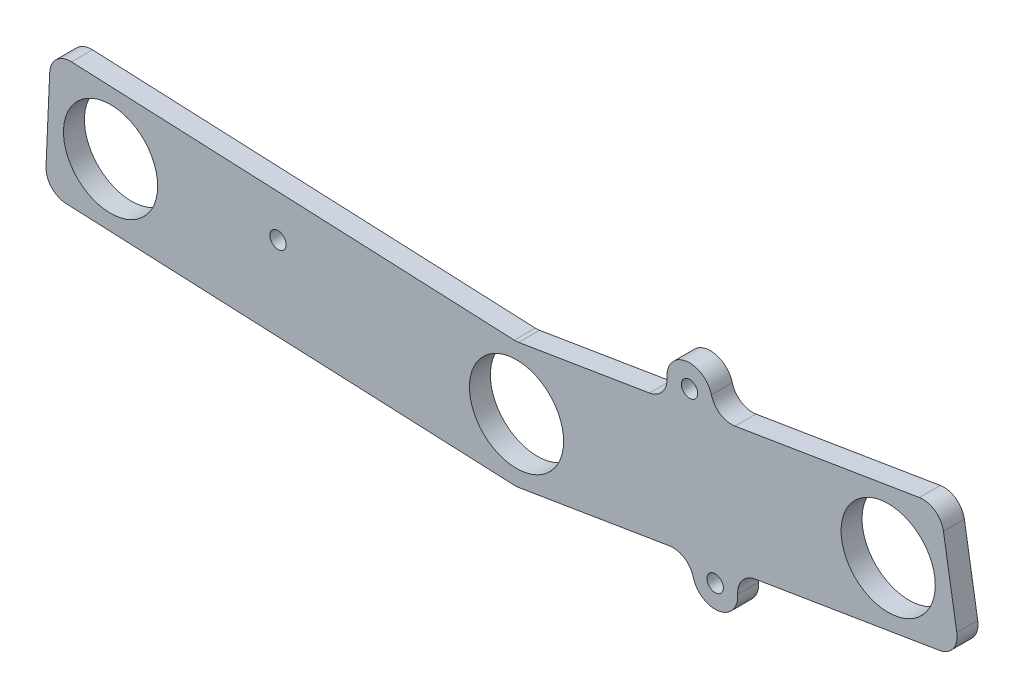
ISO-10303-21;
HEADER;
FILE_DESCRIPTION(('STEP AP214'),'2;1');
FILE_NAME('part.step','',(''),(''),'','','');
FILE_SCHEMA(('AUTOMOTIVE_DESIGN { 1 0 10303 214 1 1 1 1 }'));
ENDSEC;
DATA;
#1=APPLICATION_CONTEXT('core data for automotive mechanical design processes');
#2=APPLICATION_PROTOCOL_DEFINITION('international standard','automotive_design',2000,#1);
#3=PRODUCT_CONTEXT('',#1,'mechanical');
#4=PRODUCT('Part','Part','',(#3));
#5=PRODUCT_RELATED_PRODUCT_CATEGORY('part','',(#4));
#6=PRODUCT_DEFINITION_FORMATION('','',#4);
#7=PRODUCT_DEFINITION_CONTEXT('part definition',#1,'design');
#8=PRODUCT_DEFINITION('design','',#6,#7);
#9=PRODUCT_DEFINITION_SHAPE('','',#8);
#10=(LENGTH_UNIT() NAMED_UNIT(*) SI_UNIT(.MILLI.,.METRE.));
#11=(NAMED_UNIT(*) PLANE_ANGLE_UNIT() SI_UNIT($,.RADIAN.));
#12=(NAMED_UNIT(*) SI_UNIT($,.STERADIAN.) SOLID_ANGLE_UNIT());
#13=UNCERTAINTY_MEASURE_WITH_UNIT(LENGTH_MEASURE(1.E-05),#10,'distance_accuracy_value','');
#14=(GEOMETRIC_REPRESENTATION_CONTEXT(3) GLOBAL_UNCERTAINTY_ASSIGNED_CONTEXT((#13)) GLOBAL_UNIT_ASSIGNED_CONTEXT((#10,
#11,#12)) REPRESENTATION_CONTEXT('',''));
#15=CARTESIAN_POINT('',(0.,0.,0.));
#16=DIRECTION('',(0.,0.,1.));
#17=DIRECTION('',(1.,0.,0.));
#18=AXIS2_PLACEMENT_3D('',#15,#16,#17);
#19=CARTESIAN_POINT('',(630.154162365502,235.035371782624,3.175));
#20=DIRECTION('',(0.,0.,-1.));
#21=DIRECTION('',(-1.,0.,0.));
#22=AXIS2_PLACEMENT_3D('',#19,#20,#21);
#23=CYLINDRICAL_SURFACE('',#22,6.858);
#24=CARTESIAN_POINT('',(630.154162365502,235.035371782624,-3.175));
#25=DIRECTION('',(0.,0.,1.));
#26=DIRECTION('',(1.,0.,0.));
#27=AXIS2_PLACEMENT_3D('',#24,#25,#26);
#28=CIRCLE('',#27,6.858);
#29=CARTESIAN_POINT('',(636.785017529653,236.785778533083,-3.175));
#30=VERTEX_POINT('',#29);
#31=CARTESIAN_POINT('',(623.31217831869,234.56695070797,-3.175));
#32=VERTEX_POINT('',#31);
#33=EDGE_CURVE('E330',#30,#32,#28,.T.);
#34=ORIENTED_EDGE('',*,*,#33,.T.);
#35=DIRECTION('',(0.,0.,-1.));
#36=VECTOR('',#35,1.);
#37=CARTESIAN_POINT('',(623.31217831869,234.56695070797,3.175));
#38=LINE('',#37,#36);
#39=CARTESIAN_POINT('',(623.31217831869,234.56695070797,3.175));
#40=VERTEX_POINT('',#39);
#41=EDGE_CURVE('E294',#32,#40,#38,.F.);
#42=ORIENTED_EDGE('',*,*,#41,.T.);
#43=CARTESIAN_POINT('',(630.154162365502,235.035371782624,3.175));
#44=DIRECTION('',(0.,0.,1.));
#45=DIRECTION('',(1.,0.,0.));
#46=AXIS2_PLACEMENT_3D('',#43,#44,#45);
#47=CIRCLE('',#46,6.858);
#48=CARTESIAN_POINT('',(636.785017529653,236.785778533083,3.175));
#49=VERTEX_POINT('',#48);
#50=EDGE_CURVE('E229',#49,#40,#47,.T.);
#51=ORIENTED_EDGE('',*,*,#50,.F.);
#52=DIRECTION('',(0.,0.,-1.));
#53=VECTOR('',#52,1.);
#54=CARTESIAN_POINT('',(636.785017529653,236.785778533083,3.175));
#55=LINE('',#54,#53);
#56=EDGE_CURVE('E291',#49,#30,#55,.T.);
#57=ORIENTED_EDGE('',*,*,#56,.T.);
#58=EDGE_LOOP('',(#34,#42,#51,#57));
#59=FACE_BOUND('',#58,.T.);
#60=ADVANCED_FACE('F39',(#59),#23,.T.);
#61=CARTESIAN_POINT('',(-20.2170299694581,122.758868903176,3.175));
#62=DIRECTION('',(0.162500000001427,-0.986708543593059,0.));
#63=DIRECTION('',(0.986708543593059,0.162500000001427,0.));
#64=AXIS2_PLACEMENT_3D('',#61,#62,#63);
#65=PLANE('',#64);
#66=DIRECTION('',(-0.986708543593059,-0.162500000001427,0.));
#67=VECTOR('',#66,1.);
#68=CARTESIAN_POINT('',(-20.2170299694581,122.758868903176,3.175));
#69=LINE('',#68,#67);
#70=CARTESIAN_POINT('',(618.008882904986,227.867628238882,3.175));
#71=VERTEX_POINT('',#70);
#72=CARTESIAN_POINT('',(578.302196822218,221.32837555844,3.175));
#73=VERTEX_POINT('',#72);
#74=EDGE_CURVE('E315',#71,#73,#69,.T.);
#75=ORIENTED_EDGE('',*,*,#74,.F.);
#76=DIRECTION('',(0.,0.,1.));
#77=VECTOR('',#76,1.);
#78=CARTESIAN_POINT('',(618.008882904985,227.867628238882,-3.175));
#79=LINE('',#78,#77);
#80=CARTESIAN_POINT('',(618.008882904986,227.867628238882,-3.175));
#81=VERTEX_POINT('',#80);
#82=EDGE_CURVE('E288',#71,#81,#79,.F.);
#83=ORIENTED_EDGE('',*,*,#82,.T.);
#84=DIRECTION('',(-0.986708543593059,-0.162500000001427,0.));
#85=VECTOR('',#84,1.);
#86=CARTESIAN_POINT('',(-20.2170299694581,122.758868903176,-3.175));
#87=LINE('',#86,#85);
#88=CARTESIAN_POINT('',(578.302196822218,221.32837555844,-3.175));
#89=VERTEX_POINT('',#88);
#90=EDGE_CURVE('E206',#81,#89,#87,.T.);
#91=ORIENTED_EDGE('',*,*,#90,.T.);
#92=DIRECTION('',(0.,0.,-1.));
#93=VECTOR('',#92,1.);
#94=CARTESIAN_POINT('',(578.302196822218,221.32837555844,3.175));
#95=LINE('',#94,#93);
#96=EDGE_CURVE('E267',#89,#73,#95,.F.);
#97=ORIENTED_EDGE('',*,*,#96,.T.);
#98=EDGE_LOOP('',(#75,#83,#91,#97));
#99=FACE_BOUND('',#98,.T.);
#100=ADVANCED_FACE('F321',(#99),#65,.F.);
#101=CARTESIAN_POINT('',(10.912675494305,246.328166760933,3.175));
#102=DIRECTION('',(-0.0442579616598525,-0.99902013634847,0.));
#103=DIRECTION('',(0.99902013634847,-0.0442579616598525,0.));
#104=AXIS2_PLACEMENT_3D('',#101,#102,#103);
#105=PLANE('',#104);
#106=DIRECTION('',(-0.99902013634847,0.0442579616598525,0.));
#107=VECTOR('',#106,1.);
#108=CARTESIAN_POINT('',(10.912675494305,246.328166760933,-3.175));
#109=LINE('',#108,#107);
#110=CARTESIAN_POINT('',(576.989283765669,221.250196944443,-3.175));
#111=VERTEX_POINT('',#110);
#112=CARTESIAN_POINT('',(442.631483002649,227.202431717814,-3.175));
#113=VERTEX_POINT('',#112);
#114=EDGE_CURVE('E334',#111,#113,#109,.T.);
#115=ORIENTED_EDGE('',*,*,#114,.T.);
#116=DIRECTION('',(0.,0.,-1.));
#117=VECTOR('',#116,1.);
#118=CARTESIAN_POINT('',(442.631483002649,227.202431717814,3.175));
#119=LINE('',#118,#117);
#120=CARTESIAN_POINT('',(442.631483002649,227.202431717814,3.175));
#121=VERTEX_POINT('',#120);
#122=EDGE_CURVE('E265',#113,#121,#119,.F.);
#123=ORIENTED_EDGE('',*,*,#122,.T.);
#124=DIRECTION('',(-0.99902013634847,0.0442579616598525,0.));
#125=VECTOR('',#124,1.);
#126=CARTESIAN_POINT('',(10.912675494305,246.328166760933,3.175));
#127=LINE('',#126,#125);
#128=CARTESIAN_POINT('',(576.989283765669,221.250196944443,3.175));
#129=VERTEX_POINT('',#128);
#130=EDGE_CURVE('E325',#129,#121,#127,.T.);
#131=ORIENTED_EDGE('',*,*,#130,.F.);
#132=DIRECTION('',(0.,0.,-1.));
#133=VECTOR('',#132,1.);
#134=CARTESIAN_POINT('',(576.989283765668,221.250196944443,-3.175));
#135=LINE('',#134,#133);
#136=EDGE_CURVE('E262',#129,#111,#135,.T.);
#137=ORIENTED_EDGE('',*,*,#136,.T.);
#138=EDGE_LOOP('',(#115,#123,#131,#137));
#139=FACE_BOUND('',#138,.T.);
#140=ADVANCED_FACE('F424',(#139),#105,.F.);
#141=CARTESIAN_POINT('',(425.375029642531,-18.8446969865789,3.175));
#142=DIRECTION('',(0.99902013634847,-0.0442579616598522,0.));
#143=DIRECTION('',(0.0442579616598522,0.99902013634847,0.));
#144=AXIS2_PLACEMENT_3D('',#141,#142,#143);
#145=PLANE('',#144);
#146=DIRECTION('',(-0.0442579616598522,-0.99902013634847,0.));
#147=VECTOR('',#146,1.);
#148=CARTESIAN_POINT('',(425.375029642531,-18.8446969865789,-3.175));
#149=LINE('',#148,#147);
#150=CARTESIAN_POINT('',(436.006667080296,221.139691908542,-3.175));
#151=VERTEX_POINT('',#150);
#152=CARTESIAN_POINT('',(434.882514854135,195.76458044529,-3.175));
#153=VERTEX_POINT('',#152);
#154=EDGE_CURVE('E340',#151,#153,#149,.T.);
#155=ORIENTED_EDGE('',*,*,#154,.T.);
#156=DIRECTION('',(0.,0.,-1.));
#157=VECTOR('',#156,1.);
#158=CARTESIAN_POINT('',(434.882514854135,195.76458044529,3.175));
#159=LINE('',#158,#157);
#160=CARTESIAN_POINT('',(434.882514854135,195.76458044529,3.175));
#161=VERTEX_POINT('',#160);
#162=EDGE_CURVE('E260',#153,#161,#159,.F.);
#163=ORIENTED_EDGE('',*,*,#162,.T.);
#164=DIRECTION('',(-0.0442579616598522,-0.99902013634847,0.));
#165=VECTOR('',#164,1.);
#166=CARTESIAN_POINT('',(425.375029642531,-18.8446969865789,3.175));
#167=LINE('',#166,#165);
#168=CARTESIAN_POINT('',(436.006667080296,221.139691908542,3.175));
#169=VERTEX_POINT('',#168);
#170=EDGE_CURVE('E375',#169,#161,#167,.T.);
#171=ORIENTED_EDGE('',*,*,#170,.F.);
#172=DIRECTION('',(0.,0.,-1.));
#173=VECTOR('',#172,1.);
#174=CARTESIAN_POINT('',(436.006667080296,221.139691908542,3.175));
#175=LINE('',#174,#173);
#176=EDGE_CURVE('E257',#169,#151,#175,.T.);
#177=ORIENTED_EDGE('',*,*,#176,.T.);
#178=EDGE_LOOP('',(#155,#163,#171,#177));
#179=FACE_BOUND('',#178,.T.);
#180=ADVANCED_FACE('F394',(#179),#145,.F.);
#181=CARTESIAN_POINT('',(9.22644715506454,208.265499566057,3.175));
#182=DIRECTION('',(0.0442579616598523,0.99902013634847,0.));
#183=DIRECTION('',(-0.99902013634847,0.0442579616598523,0.));
#184=AXIS2_PLACEMENT_3D('',#181,#182,#183);
#185=PLANE('',#184);
#186=DIRECTION('',(0.99902013634847,-0.0442579616598524,0.));
#187=VECTOR('',#186,1.);
#188=CARTESIAN_POINT('',(9.22644715506454,208.265499566057,-3.175));
#189=LINE('',#188,#187);
#190=CARTESIAN_POINT('',(440.945254663408,189.139764522938,-3.175));
#191=VERTEX_POINT('',#190);
#192=CARTESIAN_POINT('',(576.989283765669,183.112827522381,-3.175));
#193=VERTEX_POINT('',#192);
#194=EDGE_CURVE('E343',#191,#193,#189,.T.);
#195=ORIENTED_EDGE('',*,*,#194,.T.);
#196=DIRECTION('',(0.,0.,-1.));
#197=VECTOR('',#196,1.);
#198=CARTESIAN_POINT('',(576.989283765669,183.112827522381,3.175));
#199=LINE('',#198,#197);
#200=CARTESIAN_POINT('',(576.989283765669,183.112827522381,3.175));
#201=VERTEX_POINT('',#200);
#202=EDGE_CURVE('E255',#193,#201,#199,.F.);
#203=ORIENTED_EDGE('',*,*,#202,.T.);
#204=DIRECTION('',(0.99902013634847,-0.0442579616598524,0.));
#205=VECTOR('',#204,1.);
#206=CARTESIAN_POINT('',(9.22644715506454,208.265499566057,3.175));
#207=LINE('',#206,#205);
#208=CARTESIAN_POINT('',(440.945254663408,189.139764522938,3.175));
#209=VERTEX_POINT('',#208);
#210=EDGE_CURVE('E371',#209,#201,#207,.T.);
#211=ORIENTED_EDGE('',*,*,#210,.F.);
#212=DIRECTION('',(0.,0.,-1.));
#213=VECTOR('',#212,1.);
#214=CARTESIAN_POINT('',(440.945254663408,189.139764522938,3.175));
#215=LINE('',#214,#213);
#216=EDGE_CURVE('E252',#209,#191,#215,.T.);
#217=ORIENTED_EDGE('',*,*,#216,.T.);
#218=EDGE_LOOP('',(#195,#203,#211,#217));
#219=FACE_BOUND('',#218,.T.);
#220=ADVANCED_FACE('F403',(#219),#185,.F.);
#221=CARTESIAN_POINT('',(-14.1020788805811,85.6285643924335,3.175));
#222=DIRECTION('',(-0.162500000001427,0.986708543593059,0.));
#223=DIRECTION('',(-0.986708543593059,-0.162500000001427,0.));
#224=AXIS2_PLACEMENT_3D('',#221,#222,#223);
#225=PLANE('',#224);
#226=DIRECTION('',(0.986708543593059,0.162500000001427,0.));
#227=VECTOR('',#226,1.);
#228=CARTESIAN_POINT('',(-14.1020788805811,85.6285643924335,-3.175));
#229=LINE('',#228,#227);
#230=CARTESIAN_POINT('',(578.302196822218,183.191006136378,-3.175));
#231=VERTEX_POINT('',#230);
#232=CARTESIAN_POINT('',(624.123833993863,190.737323728139,-3.175));
#233=VERTEX_POINT('',#232);
#234=EDGE_CURVE('E209',#231,#233,#229,.T.);
#235=ORIENTED_EDGE('',*,*,#234,.T.);
#236=DIRECTION('',(0.,0.,1.));
#237=VECTOR('',#236,1.);
#238=CARTESIAN_POINT('',(624.123833993862,190.737323728139,3.175));
#239=LINE('',#238,#237);
#240=CARTESIAN_POINT('',(624.123833993863,190.737323728139,3.175));
#241=VERTEX_POINT('',#240);
#242=EDGE_CURVE('E286',#233,#241,#239,.T.);
#243=ORIENTED_EDGE('',*,*,#242,.T.);
#244=DIRECTION('',(0.986708543593059,0.162500000001427,0.));
#245=VECTOR('',#244,1.);
#246=CARTESIAN_POINT('',(-14.1020788805811,85.6285643924335,3.175));
#247=LINE('',#246,#245);
#248=CARTESIAN_POINT('',(578.302196822218,183.191006136378,3.175));
#249=VERTEX_POINT('',#248);
#250=EDGE_CURVE('E366',#249,#241,#247,.T.);
#251=ORIENTED_EDGE('',*,*,#250,.F.);
#252=DIRECTION('',(0.,0.,-1.));
#253=VECTOR('',#252,1.);
#254=CARTESIAN_POINT('',(578.302196822218,183.191006136378,3.175));
#255=LINE('',#254,#253);
#256=EDGE_CURVE('E249',#249,#231,#255,.T.);
#257=ORIENTED_EDGE('',*,*,#256,.T.);
#258=EDGE_LOOP('',(#235,#243,#251,#257));
#259=FACE_BOUND('',#258,.T.);
#260=ADVANCED_FACE('F408',(#259),#225,.F.);
#261=CARTESIAN_POINT('',(637.92624486557,187.842878217947,3.175));
#262=DIRECTION('',(0.,0.,-1.));
#263=DIRECTION('',(-1.,0.,0.));
#264=AXIS2_PLACEMENT_3D('',#261,#262,#263);
#265=CYLINDRICAL_SURFACE('',#264,6.858);
#266=CARTESIAN_POINT('',(637.92624486557,187.842878217947,-3.175));
#267=DIRECTION('',(0.,0.,1.));
#268=DIRECTION('',(1.,0.,0.));
#269=AXIS2_PLACEMENT_3D('',#266,#267,#268);
#270=CIRCLE('',#269,6.858);
#271=CARTESIAN_POINT('',(631.295389701419,186.092471467489,-3.175));
#272=VERTEX_POINT('',#271);
#273=CARTESIAN_POINT('',(644.768228912381,188.311299292601,-3.175));
#274=VERTEX_POINT('',#273);
#275=EDGE_CURVE('E207',#272,#274,#270,.T.);
#276=ORIENTED_EDGE('',*,*,#275,.T.);
#277=DIRECTION('',(0.,0.,-1.));
#278=VECTOR('',#277,1.);
#279=CARTESIAN_POINT('',(644.768228912381,188.311299292601,3.175));
#280=LINE('',#279,#278);
#281=CARTESIAN_POINT('',(644.768228912381,188.311299292601,3.175));
#282=VERTEX_POINT('',#281);
#283=EDGE_CURVE('E284',#274,#282,#280,.F.);
#284=ORIENTED_EDGE('',*,*,#283,.T.);
#285=CARTESIAN_POINT('',(637.92624486557,187.842878217947,3.175));
#286=DIRECTION('',(0.,0.,1.));
#287=DIRECTION('',(1.,0.,0.));
#288=AXIS2_PLACEMENT_3D('',#285,#286,#287);
#289=CIRCLE('',#288,6.858);
#290=CARTESIAN_POINT('',(631.295389701419,186.092471467489,3.175));
#291=VERTEX_POINT('',#290);
#292=EDGE_CURVE('E362',#291,#282,#289,.T.);
#293=ORIENTED_EDGE('',*,*,#292,.F.);
#294=DIRECTION('',(0.,0.,-1.));
#295=VECTOR('',#294,1.);
#296=CARTESIAN_POINT('',(631.295389701419,186.092471467489,3.175));
#297=LINE('',#296,#295);
#298=EDGE_CURVE('E281',#291,#272,#297,.T.);
#299=ORIENTED_EDGE('',*,*,#298,.T.);
#300=EDGE_LOOP('',(#276,#284,#293,#299));
#301=FACE_BOUND('',#300,.T.);
#302=ADVANCED_FACE('F353',(#301),#265,.T.);
#303=CARTESIAN_POINT('',(650.071524326087,195.01062176169,3.175));
#304=VERTEX_POINT('',#303);
#305=CARTESIAN_POINT('',(706.01927092995,204.224597745014,3.175));
#306=VERTEX_POINT('',#305);
#307=EDGE_CURVE('E361',#304,#306,#247,.T.);
#308=ORIENTED_EDGE('',*,*,#307,.F.);
#309=DIRECTION('',(0.,0.,1.));
#310=VECTOR('',#309,1.);
#311=CARTESIAN_POINT('',(650.071524326086,195.01062176169,-3.175));
#312=LINE('',#311,#310);
#313=CARTESIAN_POINT('',(650.071524326087,195.01062176169,-3.175));
#314=VERTEX_POINT('',#313);
#315=EDGE_CURVE('E278',#304,#314,#312,.F.);
#316=ORIENTED_EDGE('',*,*,#315,.T.);
#317=CARTESIAN_POINT('',(706.01927092995,204.224597745014,-3.175));
#318=VERTEX_POINT('',#317);
#319=EDGE_CURVE('E202',#314,#318,#229,.T.);
#320=ORIENTED_EDGE('',*,*,#319,.T.);
#321=DIRECTION('',(0.,0.,-1.));
#322=VECTOR('',#321,1.);
#323=CARTESIAN_POINT('',(706.01927092995,204.224597745014,3.175));
#324=LINE('',#323,#322);
#325=EDGE_CURVE('E183',#318,#306,#324,.F.);
#326=ORIENTED_EDGE('',*,*,#325,.T.);
#327=EDGE_LOOP('',(#308,#316,#320,#326));
#328=FACE_BOUND('',#327,.T.);
#329=ADVANCED_FACE('F364',(#328),#225,.F.);
#330=CARTESIAN_POINT('',(726.386949062347,119.62790835259,3.175));
#331=DIRECTION('',(-0.986708543593059,-0.162500000001427,0.));
#332=DIRECTION('',(0.162500000001427,-0.986708543593059,0.));
#333=AXIS2_PLACEMENT_3D('',#330,#331,#332);
#334=PLANE('',#333);
#335=DIRECTION('',(-0.162500000001427,0.986708543593059,0.));
#336=VECTOR('',#335,1.);
#337=CARTESIAN_POINT('',(726.386949062347,119.62790835259,3.175));
#338=LINE('',#337,#336);
#339=CARTESIAN_POINT('',(711.252995181756,211.522071996839,3.175));
#340=VERTEX_POINT('',#339);
#341=CARTESIAN_POINT('',(707.201794092898,236.12117800395,3.175));
#342=VERTEX_POINT('',#341);
#343=EDGE_CURVE('E195',#340,#342,#338,.T.);
#344=ORIENTED_EDGE('',*,*,#343,.F.);
#345=DIRECTION('',(0.,0.,-1.));
#346=VECTOR('',#345,1.);
#347=CARTESIAN_POINT('',(711.252995181756,211.522071996839,3.175));
#348=LINE('',#347,#346);
#349=CARTESIAN_POINT('',(711.252995181756,211.522071996839,-3.175));
#350=VERTEX_POINT('',#349);
#351=EDGE_CURVE('E181',#340,#350,#348,.T.);
#352=ORIENTED_EDGE('',*,*,#351,.T.);
#353=DIRECTION('',(-0.162500000001427,0.986708543593059,0.));
#354=VECTOR('',#353,1.);
#355=CARTESIAN_POINT('',(726.386949062347,119.62790835259,-3.175));
#356=LINE('',#355,#354);
#357=CARTESIAN_POINT('',(707.201794092898,236.12117800395,-3.175));
#358=VERTEX_POINT('',#357);
#359=EDGE_CURVE('E192',#350,#358,#356,.T.);
#360=ORIENTED_EDGE('',*,*,#359,.T.);
#361=DIRECTION('',(0.,0.,-1.));
#362=VECTOR('',#361,1.);
#363=CARTESIAN_POINT('',(707.201794092898,236.12117800395,3.175));
#364=LINE('',#363,#362);
#365=EDGE_CURVE('E197',#358,#342,#364,.F.);
#366=ORIENTED_EDGE('',*,*,#365,.T.);
#367=EDGE_LOOP('',(#344,#352,#360,#366));
#368=FACE_BOUND('',#367,.T.);
#369=ADVANCED_FACE('F191',(#368),#334,.F.);
#370=CARTESIAN_POINT('',(637.92624486557,187.842878217947,3.175));
#371=DIRECTION('',(0.,0.,-1.));
#372=DIRECTION('',(-1.,0.,0.));
#373=AXIS2_PLACEMENT_3D('',#370,#371,#372);
#374=CYLINDRICAL_SURFACE('',#373,2.48919999999995);
#375=CARTESIAN_POINT('',(637.92624486557,187.842878217947,3.175));
#376=DIRECTION('',(0.,0.,1.));
#377=DIRECTION('',(1.,0.,0.));
#378=AXIS2_PLACEMENT_3D('',#375,#376,#377);
#379=CIRCLE('',#378,2.48919999999995);
#380=CARTESIAN_POINT('',(640.41544486557,187.842878217947,3.175));
#381=VERTEX_POINT('',#380);
#382=EDGE_CURVE('E463',#381,#381,#379,.T.);
#383=ORIENTED_EDGE('',*,*,#382,.T.);
#384=EDGE_LOOP('',(#383));
#385=FACE_BOUND('',#384,.T.);
#386=CARTESIAN_POINT('',(637.92624486557,187.842878217947,-3.175));
#387=DIRECTION('',(0.,0.,1.));
#388=DIRECTION('',(1.,0.,0.));
#389=AXIS2_PLACEMENT_3D('',#386,#387,#388);
#390=CIRCLE('',#389,2.48919999999995);
#391=CARTESIAN_POINT('',(640.41544486557,187.842878217947,-3.175));
#392=VERTEX_POINT('',#391);
#393=EDGE_CURVE('E223',#392,#392,#390,.T.);
#394=ORIENTED_EDGE('',*,*,#393,.F.);
#395=EDGE_LOOP('',(#394));
#396=FACE_BOUND('',#395,.T.);
#397=ADVANCED_FACE('F482',(#385,#396),#374,.F.);
#398=CARTESIAN_POINT('',(454.475924564654,207.609022007296,3.175));
#399=DIRECTION('',(0.,0.,-1.));
#400=DIRECTION('',(-1.,0.,0.));
#401=AXIS2_PLACEMENT_3D('',#398,#399,#400);
#402=CYLINDRICAL_SURFACE('',#401,14.2875);
#403=CARTESIAN_POINT('',(454.475924564654,207.609022007296,3.175));
#404=DIRECTION('',(0.,0.,1.));
#405=DIRECTION('',(1.,0.,0.));
#406=AXIS2_PLACEMENT_3D('',#403,#404,#405);
#407=CIRCLE('',#406,14.2875);
#408=CARTESIAN_POINT('',(468.763424564654,207.609022007296,3.175));
#409=VERTEX_POINT('',#408);
#410=EDGE_CURVE('E461',#409,#409,#407,.T.);
#411=ORIENTED_EDGE('',*,*,#410,.T.);
#412=EDGE_LOOP('',(#411));
#413=FACE_BOUND('',#412,.T.);
#414=CARTESIAN_POINT('',(454.475924564654,207.609022007296,-3.175));
#415=DIRECTION('',(0.,0.,1.));
#416=DIRECTION('',(1.,0.,0.));
#417=AXIS2_PLACEMENT_3D('',#414,#415,#416);
#418=CIRCLE('',#417,14.2875);
#419=CARTESIAN_POINT('',(468.763424564654,207.609022007296,-3.175));
#420=VERTEX_POINT('',#419);
#421=EDGE_CURVE('E220',#420,#420,#418,.T.);
#422=ORIENTED_EDGE('',*,*,#421,.F.);
#423=EDGE_LOOP('',(#422));
#424=FACE_BOUND('',#423,.T.);
#425=ADVANCED_FACE('F485',(#413,#424),#402,.F.);
#426=CARTESIAN_POINT('',(577.649810349193,202.152250000204,3.175));
#427=DIRECTION('',(0.,0.,-1.));
#428=DIRECTION('',(-1.,0.,0.));
#429=AXIS2_PLACEMENT_3D('',#426,#427,#428);
#430=CYLINDRICAL_SURFACE('',#429,14.2875);
#431=CARTESIAN_POINT('',(577.649810349193,202.152250000204,3.175));
#432=DIRECTION('',(0.,0.,1.));
#433=DIRECTION('',(1.,0.,0.));
#434=AXIS2_PLACEMENT_3D('',#431,#432,#433);
#435=CIRCLE('',#434,14.2875);
#436=CARTESIAN_POINT('',(591.937310349193,202.152250000204,3.175));
#437=VERTEX_POINT('',#436);
#438=EDGE_CURVE('E456',#437,#437,#435,.T.);
#439=ORIENTED_EDGE('',*,*,#438,.T.);
#440=EDGE_LOOP('',(#439));
#441=FACE_BOUND('',#440,.T.);
#442=CARTESIAN_POINT('',(577.649810349193,202.152250000204,-3.175));
#443=DIRECTION('',(0.,0.,1.));
#444=DIRECTION('',(1.,0.,0.));
#445=AXIS2_PLACEMENT_3D('',#442,#443,#444);
#446=CIRCLE('',#445,14.2875);
#447=CARTESIAN_POINT('',(591.937310349193,202.152250000204,-3.175));
#448=VERTEX_POINT('',#447);
#449=EDGE_CURVE('E217',#448,#448,#446,.T.);
#450=ORIENTED_EDGE('',*,*,#449,.F.);
#451=EDGE_LOOP('',(#450));
#452=FACE_BOUND('',#451,.T.);
#453=ADVANCED_FACE('F488',(#441,#452),#430,.F.);
#454=CARTESIAN_POINT('',(690.430596881879,220.726000000367,3.175));
#455=DIRECTION('',(0.,0.,-1.));
#456=DIRECTION('',(-1.,0.,0.));
#457=AXIS2_PLACEMENT_3D('',#454,#455,#456);
#458=CYLINDRICAL_SURFACE('',#457,14.2875);
#459=CARTESIAN_POINT('',(690.430596881879,220.726000000367,3.175));
#460=DIRECTION('',(0.,0.,1.));
#461=DIRECTION('',(1.,0.,0.));
#462=AXIS2_PLACEMENT_3D('',#459,#460,#461);
#463=CIRCLE('',#462,14.2875);
#464=CARTESIAN_POINT('',(704.718096881879,220.726000000367,3.175));
#465=VERTEX_POINT('',#464);
#466=EDGE_CURVE('E451',#465,#465,#463,.T.);
#467=ORIENTED_EDGE('',*,*,#466,.T.);
#468=EDGE_LOOP('',(#467));
#469=FACE_BOUND('',#468,.T.);
#470=CARTESIAN_POINT('',(690.430596881879,220.726000000367,-3.175));
#471=DIRECTION('',(0.,0.,1.));
#472=DIRECTION('',(1.,0.,0.));
#473=AXIS2_PLACEMENT_3D('',#470,#471,#472);
#474=CIRCLE('',#473,14.2875);
#475=CARTESIAN_POINT('',(704.718096881879,220.726000000367,-3.175));
#476=VERTEX_POINT('',#475);
#477=EDGE_CURVE('E214',#476,#476,#474,.T.);
#478=ORIENTED_EDGE('',*,*,#477,.F.);
#479=EDGE_LOOP('',(#478));
#480=FACE_BOUND('',#479,.T.);
#481=ADVANCED_FACE('F492',(#469,#480),#458,.F.);
#482=CARTESIAN_POINT('',(505.275924564654,211.714740599387,3.175));
#483=DIRECTION('',(0.,0.,-1.));
#484=DIRECTION('',(-1.,0.,0.));
#485=AXIS2_PLACEMENT_3D('',#482,#483,#484);
#486=CYLINDRICAL_SURFACE('',#485,2.48919999999983);
#487=CARTESIAN_POINT('',(505.275924564654,211.714740599387,3.175));
#488=DIRECTION('',(0.,0.,1.));
#489=DIRECTION('',(1.,0.,0.));
#490=AXIS2_PLACEMENT_3D('',#487,#488,#489);
#491=CIRCLE('',#490,2.48919999999983);
#492=CARTESIAN_POINT('',(507.765124564654,211.714740599387,3.175));
#493=VERTEX_POINT('',#492);
#494=EDGE_CURVE('E449',#493,#493,#491,.T.);
#495=ORIENTED_EDGE('',*,*,#494,.T.);
#496=EDGE_LOOP('',(#495));
#497=FACE_BOUND('',#496,.T.);
#498=CARTESIAN_POINT('',(505.275924564654,211.714740599387,-3.175));
#499=DIRECTION('',(0.,0.,1.));
#500=DIRECTION('',(1.,0.,0.));
#501=AXIS2_PLACEMENT_3D('',#498,#499,#500);
#502=CIRCLE('',#501,2.48919999999983);
#503=CARTESIAN_POINT('',(507.765124564654,211.714740599387,-3.175));
#504=VERTEX_POINT('',#503);
#505=EDGE_CURVE('E204',#504,#504,#502,.T.);
#506=ORIENTED_EDGE('',*,*,#505,.F.);
#507=EDGE_LOOP('',(#506));
#508=FACE_BOUND('',#507,.T.);
#509=ADVANCED_FACE('F496',(#497,#508),#486,.F.);
#510=CARTESIAN_POINT('',(699.904319841073,241.354902255757,-3.175));
#511=VERTEX_POINT('',#510);
#512=CARTESIAN_POINT('',(643.956573237209,232.140926272432,-3.175));
#513=VERTEX_POINT('',#512);
#514=EDGE_CURVE('E201',#511,#513,#87,.T.);
#515=ORIENTED_EDGE('',*,*,#514,.T.);
#516=DIRECTION('',(0.,0.,1.));
#517=VECTOR('',#516,1.);
#518=CARTESIAN_POINT('',(643.956573237209,232.140926272432,3.175));
#519=LINE('',#518,#517);
#520=CARTESIAN_POINT('',(643.956573237209,232.140926272432,3.175));
#521=VERTEX_POINT('',#520);
#522=EDGE_CURVE('E60',#513,#521,#519,.T.);
#523=ORIENTED_EDGE('',*,*,#522,.T.);
#524=CARTESIAN_POINT('',(699.904319841073,241.354902255757,3.175));
#525=VERTEX_POINT('',#524);
#526=EDGE_CURVE('E327',#525,#521,#69,.T.);
#527=ORIENTED_EDGE('',*,*,#526,.F.);
#528=DIRECTION('',(0.,0.,-1.));
#529=VECTOR('',#528,1.);
#530=CARTESIAN_POINT('',(699.904319841073,241.354902255757,3.175));
#531=LINE('',#530,#529);
#532=EDGE_CURVE('E270',#525,#511,#531,.T.);
#533=ORIENTED_EDGE('',*,*,#532,.T.);
#534=EDGE_LOOP('',(#515,#523,#527,#533));
#535=FACE_BOUND('',#534,.T.);
#536=ADVANCED_FACE('F426',(#535),#65,.F.);
#537=CARTESIAN_POINT('',(630.154162365502,235.035371782624,3.175));
#538=DIRECTION('',(0.,0.,-1.));
#539=DIRECTION('',(-1.,0.,0.));
#540=AXIS2_PLACEMENT_3D('',#537,#538,#539);
#541=CYLINDRICAL_SURFACE('',#540,2.48919999999995);
#542=CARTESIAN_POINT('',(630.154162365502,235.035371782624,3.175));
#543=DIRECTION('',(0.,0.,1.));
#544=DIRECTION('',(1.,0.,0.));
#545=AXIS2_PLACEMENT_3D('',#542,#543,#544);
#546=CIRCLE('',#545,2.48919999999995);
#547=CARTESIAN_POINT('',(632.643362365502,235.035371782624,3.175));
#548=VERTEX_POINT('',#547);
#549=EDGE_CURVE('E230',#548,#548,#546,.T.);
#550=ORIENTED_EDGE('',*,*,#549,.T.);
#551=EDGE_LOOP('',(#550));
#552=FACE_BOUND('',#551,.T.);
#553=CARTESIAN_POINT('',(630.154162365502,235.035371782624,-3.175));
#554=DIRECTION('',(0.,0.,1.));
#555=DIRECTION('',(1.,0.,0.));
#556=AXIS2_PLACEMENT_3D('',#553,#554,#555);
#557=CIRCLE('',#556,2.48919999999995);
#558=CARTESIAN_POINT('',(632.643362365502,235.035371782624,-3.175));
#559=VERTEX_POINT('',#558);
#560=EDGE_CURVE('E226',#559,#559,#557,.T.);
#561=ORIENTED_EDGE('',*,*,#560,.F.);
#562=EDGE_LOOP('',(#561));
#563=FACE_BOUND('',#562,.T.);
#564=ADVANCED_FACE('F470',(#552,#563),#541,.F.);
#565=CARTESIAN_POINT('',(0.,0.,3.175));
#566=DIRECTION('',(0.,0.,1.));
#567=DIRECTION('',(1.,0.,0.));
#568=AXIS2_PLACEMENT_3D('',#565,#566,#567);
#569=PLANE('',#568);
#570=ORIENTED_EDGE('',*,*,#292,.T.);
#571=CARTESIAN_POINT('',(651.103399326095,188.745022509874,3.175));
#572=DIRECTION('',(0.,0.,1.));
#573=DIRECTION('',(1.,0.,0.));
#574=AXIS2_PLACEMENT_3D('',#571,#572,#573);
#575=CIRCLE('',#574,6.35);
#576=EDGE_CURVE('E299',#282,#304,#575,.F.);
#577=ORIENTED_EDGE('',*,*,#576,.T.);
#578=ORIENTED_EDGE('',*,*,#307,.T.);
#579=CARTESIAN_POINT('',(704.98739592994,210.49019699683,3.175));
#580=DIRECTION('',(0.,0.,1.));
#581=DIRECTION('',(1.,0.,0.));
#582=AXIS2_PLACEMENT_3D('',#579,#580,#581);
#583=CIRCLE('',#582,6.35);
#584=EDGE_CURVE('E247',#306,#340,#583,.T.);
#585=ORIENTED_EDGE('',*,*,#584,.T.);
#586=ORIENTED_EDGE('',*,*,#343,.T.);
#587=CARTESIAN_POINT('',(700.936194841082,235.089303003941,3.175));
#588=DIRECTION('',(0.,0.,1.));
#589=DIRECTION('',(1.,0.,0.));
#590=AXIS2_PLACEMENT_3D('',#587,#588,#589);
#591=CIRCLE('',#590,6.35);
#592=EDGE_CURVE('E239',#342,#525,#591,.T.);
#593=ORIENTED_EDGE('',*,*,#592,.T.);
#594=ORIENTED_EDGE('',*,*,#526,.T.);
#595=CARTESIAN_POINT('',(642.9246982372,238.406525524248,3.175));
#596=DIRECTION('',(0.,0.,1.));
#597=DIRECTION('',(1.,0.,0.));
#598=AXIS2_PLACEMENT_3D('',#595,#596,#597);
#599=CIRCLE('',#598,6.35);
#600=EDGE_CURVE('E11',#521,#49,#599,.F.);
#601=ORIENTED_EDGE('',*,*,#600,.T.);
#602=ORIENTED_EDGE('',*,*,#50,.T.);
#603=CARTESIAN_POINT('',(616.977007904976,234.133227490698,3.175));
#604=DIRECTION('',(0.,0.,1.));
#605=DIRECTION('',(1.,0.,0.));
#606=AXIS2_PLACEMENT_3D('',#603,#604,#605);
#607=CIRCLE('',#606,6.35);
#608=EDGE_CURVE('E307',#40,#71,#607,.F.);
#609=ORIENTED_EDGE('',*,*,#608,.T.);
#610=ORIENTED_EDGE('',*,*,#74,.T.);
#611=CARTESIAN_POINT('',(577.270321822209,227.593974810256,3.175));
#612=DIRECTION('',(0.,0.,1.));
#613=DIRECTION('',(1.,0.,0.));
#614=AXIS2_PLACEMENT_3D('',#611,#612,#613);
#615=CIRCLE('',#614,6.35);
#616=EDGE_CURVE('E276',#73,#129,#615,.F.);
#617=ORIENTED_EDGE('',*,*,#616,.T.);
#618=ORIENTED_EDGE('',*,*,#130,.T.);
#619=CARTESIAN_POINT('',(442.350444946108,220.858653852002,3.175));
#620=DIRECTION('',(0.,0.,1.));
#621=DIRECTION('',(1.,0.,0.));
#622=AXIS2_PLACEMENT_3D('',#619,#620,#621);
#623=CIRCLE('',#622,6.35);
#624=EDGE_CURVE('E241',#121,#169,#623,.T.);
#625=ORIENTED_EDGE('',*,*,#624,.T.);
#626=ORIENTED_EDGE('',*,*,#170,.T.);
#627=CARTESIAN_POINT('',(441.226292719948,195.48354238875,3.175));
#628=DIRECTION('',(0.,0.,1.));
#629=DIRECTION('',(1.,0.,0.));
#630=AXIS2_PLACEMENT_3D('',#627,#628,#629);
#631=CIRCLE('',#630,6.35);
#632=EDGE_CURVE('E243',#161,#209,#631,.T.);
#633=ORIENTED_EDGE('',*,*,#632,.T.);
#634=ORIENTED_EDGE('',*,*,#210,.T.);
#635=CARTESIAN_POINT('',(577.270321822209,189.456605388194,3.175));
#636=DIRECTION('',(0.,0.,1.));
#637=DIRECTION('',(1.,0.,0.));
#638=AXIS2_PLACEMENT_3D('',#635,#636,#637);
#639=CIRCLE('',#638,6.35);
#640=EDGE_CURVE('E245',#201,#249,#639,.T.);
#641=ORIENTED_EDGE('',*,*,#640,.T.);
#642=ORIENTED_EDGE('',*,*,#250,.T.);
#643=CARTESIAN_POINT('',(625.155708993871,184.471724476323,3.175));
#644=DIRECTION('',(0.,0.,1.));
#645=DIRECTION('',(1.,0.,0.));
#646=AXIS2_PLACEMENT_3D('',#643,#644,#645);
#647=CIRCLE('',#646,6.35);
#648=EDGE_CURVE('E303',#241,#291,#647,.F.);
#649=ORIENTED_EDGE('',*,*,#648,.T.);
#650=EDGE_LOOP('',(#570,#577,#578,#585,#586,#593,#594,#601,#602,#609,#610,#617,#618,#625,#626,
#633,#634,#641,#642,#649));
#651=FACE_BOUND('',#650,.T.);
#652=ORIENTED_EDGE('',*,*,#494,.F.);
#653=EDGE_LOOP('',(#652));
#654=FACE_BOUND('',#653,.T.);
#655=ORIENTED_EDGE('',*,*,#466,.F.);
#656=EDGE_LOOP('',(#655));
#657=FACE_BOUND('',#656,.T.);
#658=ORIENTED_EDGE('',*,*,#438,.F.);
#659=EDGE_LOOP('',(#658));
#660=FACE_BOUND('',#659,.T.);
#661=ORIENTED_EDGE('',*,*,#410,.F.);
#662=EDGE_LOOP('',(#661));
#663=FACE_BOUND('',#662,.T.);
#664=ORIENTED_EDGE('',*,*,#382,.F.);
#665=EDGE_LOOP('',(#664));
#666=FACE_BOUND('',#665,.T.);
#667=ORIENTED_EDGE('',*,*,#549,.F.);
#668=EDGE_LOOP('',(#667));
#669=FACE_BOUND('',#668,.T.);
#670=ADVANCED_FACE('F313',(#651,#654,#657,#660,#663,#666,#669),#569,.T.);
#671=CARTESIAN_POINT('',(0.,0.,-3.175));
#672=DIRECTION('',(0.,0.,1.));
#673=DIRECTION('',(1.,0.,0.));
#674=AXIS2_PLACEMENT_3D('',#671,#672,#673);
#675=PLANE('',#674);
#676=ORIENTED_EDGE('',*,*,#359,.F.);
#677=CARTESIAN_POINT('',(704.98739592994,210.49019699683,-3.175));
#678=DIRECTION('',(0.,0.,1.));
#679=DIRECTION('',(1.,0.,0.));
#680=AXIS2_PLACEMENT_3D('',#677,#678,#679);
#681=CIRCLE('',#680,6.35);
#682=EDGE_CURVE('E177',#350,#318,#681,.F.);
#683=ORIENTED_EDGE('',*,*,#682,.T.);
#684=ORIENTED_EDGE('',*,*,#319,.F.);
#685=CARTESIAN_POINT('',(651.103399326095,188.745022509874,-3.175));
#686=DIRECTION('',(0.,0.,1.));
#687=DIRECTION('',(1.,0.,0.));
#688=AXIS2_PLACEMENT_3D('',#685,#686,#687);
#689=CIRCLE('',#688,6.35);
#690=EDGE_CURVE('E297',#314,#274,#689,.T.);
#691=ORIENTED_EDGE('',*,*,#690,.T.);
#692=ORIENTED_EDGE('',*,*,#275,.F.);
#693=CARTESIAN_POINT('',(625.155708993871,184.471724476323,-3.175));
#694=DIRECTION('',(0.,0.,1.));
#695=DIRECTION('',(1.,0.,0.));
#696=AXIS2_PLACEMENT_3D('',#693,#694,#695);
#697=CIRCLE('',#696,6.35);
#698=EDGE_CURVE('E301',#272,#233,#697,.T.);
#699=ORIENTED_EDGE('',*,*,#698,.T.);
#700=ORIENTED_EDGE('',*,*,#234,.F.);
#701=CARTESIAN_POINT('',(577.270321822209,189.456605388194,-3.175));
#702=DIRECTION('',(0.,0.,1.));
#703=DIRECTION('',(1.,0.,0.));
#704=AXIS2_PLACEMENT_3D('',#701,#702,#703);
#705=CIRCLE('',#704,6.35);
#706=EDGE_CURVE('E186',#231,#193,#705,.F.);
#707=ORIENTED_EDGE('',*,*,#706,.T.);
#708=ORIENTED_EDGE('',*,*,#194,.F.);
#709=CARTESIAN_POINT('',(441.226292719948,195.48354238875,-3.175));
#710=DIRECTION('',(0.,0.,1.));
#711=DIRECTION('',(1.,0.,0.));
#712=AXIS2_PLACEMENT_3D('',#709,#710,#711);
#713=CIRCLE('',#712,6.35);
#714=EDGE_CURVE('E235',#191,#153,#713,.F.);
#715=ORIENTED_EDGE('',*,*,#714,.T.);
#716=ORIENTED_EDGE('',*,*,#154,.F.);
#717=CARTESIAN_POINT('',(442.350444946108,220.858653852002,-3.175));
#718=DIRECTION('',(0.,0.,1.));
#719=DIRECTION('',(1.,0.,0.));
#720=AXIS2_PLACEMENT_3D('',#717,#718,#719);
#721=CIRCLE('',#720,6.35);
#722=EDGE_CURVE('E233',#151,#113,#721,.F.);
#723=ORIENTED_EDGE('',*,*,#722,.T.);
#724=ORIENTED_EDGE('',*,*,#114,.F.);
#725=CARTESIAN_POINT('',(577.270321822209,227.593974810256,-3.175));
#726=DIRECTION('',(0.,0.,1.));
#727=DIRECTION('',(1.,0.,0.));
#728=AXIS2_PLACEMENT_3D('',#725,#726,#727);
#729=CIRCLE('',#728,6.35);
#730=EDGE_CURVE('E273',#111,#89,#729,.T.);
#731=ORIENTED_EDGE('',*,*,#730,.T.);
#732=ORIENTED_EDGE('',*,*,#90,.F.);
#733=CARTESIAN_POINT('',(616.977007904976,234.133227490698,-3.175));
#734=DIRECTION('',(0.,0.,1.));
#735=DIRECTION('',(1.,0.,0.));
#736=AXIS2_PLACEMENT_3D('',#733,#734,#735);
#737=CIRCLE('',#736,6.35);
#738=EDGE_CURVE('E305',#81,#32,#737,.T.);
#739=ORIENTED_EDGE('',*,*,#738,.T.);
#740=ORIENTED_EDGE('',*,*,#33,.F.);
#741=CARTESIAN_POINT('',(642.9246982372,238.406525524248,-3.175));
#742=DIRECTION('',(0.,0.,1.));
#743=DIRECTION('',(1.,0.,0.));
#744=AXIS2_PLACEMENT_3D('',#741,#742,#743);
#745=CIRCLE('',#744,6.35);
#746=EDGE_CURVE('E47',#30,#513,#745,.T.);
#747=ORIENTED_EDGE('',*,*,#746,.T.);
#748=ORIENTED_EDGE('',*,*,#514,.F.);
#749=CARTESIAN_POINT('',(700.936194841082,235.089303003941,-3.175));
#750=DIRECTION('',(0.,0.,1.));
#751=DIRECTION('',(1.,0.,0.));
#752=AXIS2_PLACEMENT_3D('',#749,#750,#751);
#753=CIRCLE('',#752,6.35);
#754=EDGE_CURVE('E196',#511,#358,#753,.F.);
#755=ORIENTED_EDGE('',*,*,#754,.T.);
#756=EDGE_LOOP('',(#676,#683,#684,#691,#692,#699,#700,#707,#708,#715,#716,#723,#724,#731,#732,
#739,#740,#747,#748,#755));
#757=FACE_BOUND('',#756,.T.);
#758=ORIENTED_EDGE('',*,*,#505,.T.);
#759=EDGE_LOOP('',(#758));
#760=FACE_BOUND('',#759,.T.);
#761=ORIENTED_EDGE('',*,*,#477,.T.);
#762=EDGE_LOOP('',(#761));
#763=FACE_BOUND('',#762,.T.);
#764=ORIENTED_EDGE('',*,*,#449,.T.);
#765=EDGE_LOOP('',(#764));
#766=FACE_BOUND('',#765,.T.);
#767=ORIENTED_EDGE('',*,*,#421,.T.);
#768=EDGE_LOOP('',(#767));
#769=FACE_BOUND('',#768,.T.);
#770=ORIENTED_EDGE('',*,*,#393,.T.);
#771=EDGE_LOOP('',(#770));
#772=FACE_BOUND('',#771,.T.);
#773=ORIENTED_EDGE('',*,*,#560,.T.);
#774=EDGE_LOOP('',(#773));
#775=FACE_BOUND('',#774,.T.);
#776=ADVANCED_FACE('F199',(#757,#760,#763,#766,#769,#772,#775),#675,.F.);
#777=CARTESIAN_POINT('',(704.98739592994,210.49019699683,3.175));
#778=DIRECTION('',(0.,0.,-1.));
#779=DIRECTION('',(-1.,0.,0.));
#780=AXIS2_PLACEMENT_3D('',#777,#778,#779);
#781=CYLINDRICAL_SURFACE('',#780,6.35);
#782=ORIENTED_EDGE('',*,*,#584,.F.);
#783=ORIENTED_EDGE('',*,*,#325,.F.);
#784=ORIENTED_EDGE('',*,*,#682,.F.);
#785=ORIENTED_EDGE('',*,*,#351,.F.);
#786=EDGE_LOOP('',(#782,#783,#784,#785));
#787=FACE_BOUND('',#786,.T.);
#788=ADVANCED_FACE('F180',(#787),#781,.T.);
#789=CARTESIAN_POINT('',(577.270321822209,189.456605388194,3.175));
#790=DIRECTION('',(0.,0.,-1.));
#791=DIRECTION('',(-1.,0.,0.));
#792=AXIS2_PLACEMENT_3D('',#789,#790,#791);
#793=CYLINDRICAL_SURFACE('',#792,6.35);
#794=ORIENTED_EDGE('',*,*,#640,.F.);
#795=ORIENTED_EDGE('',*,*,#202,.F.);
#796=ORIENTED_EDGE('',*,*,#706,.F.);
#797=ORIENTED_EDGE('',*,*,#256,.F.);
#798=EDGE_LOOP('',(#794,#795,#796,#797));
#799=FACE_BOUND('',#798,.T.);
#800=ADVANCED_FACE('F406',(#799),#793,.T.);
#801=CARTESIAN_POINT('',(441.226292719948,195.48354238875,3.175));
#802=DIRECTION('',(0.,0.,-1.));
#803=DIRECTION('',(-1.,0.,0.));
#804=AXIS2_PLACEMENT_3D('',#801,#802,#803);
#805=CYLINDRICAL_SURFACE('',#804,6.35);
#806=ORIENTED_EDGE('',*,*,#632,.F.);
#807=ORIENTED_EDGE('',*,*,#162,.F.);
#808=ORIENTED_EDGE('',*,*,#714,.F.);
#809=ORIENTED_EDGE('',*,*,#216,.F.);
#810=EDGE_LOOP('',(#806,#807,#808,#809));
#811=FACE_BOUND('',#810,.T.);
#812=ADVANCED_FACE('F401',(#811),#805,.T.);
#813=CARTESIAN_POINT('',(442.350444946108,220.858653852002,3.175));
#814=DIRECTION('',(0.,0.,-1.));
#815=DIRECTION('',(-1.,0.,0.));
#816=AXIS2_PLACEMENT_3D('',#813,#814,#815);
#817=CYLINDRICAL_SURFACE('',#816,6.35);
#818=ORIENTED_EDGE('',*,*,#624,.F.);
#819=ORIENTED_EDGE('',*,*,#122,.F.);
#820=ORIENTED_EDGE('',*,*,#722,.F.);
#821=ORIENTED_EDGE('',*,*,#176,.F.);
#822=EDGE_LOOP('',(#818,#819,#820,#821));
#823=FACE_BOUND('',#822,.T.);
#824=ADVANCED_FACE('F391',(#823),#817,.T.);
#825=CARTESIAN_POINT('',(577.270321822209,227.593974810256,3.175));
#826=DIRECTION('',(0.,0.,1.));
#827=DIRECTION('',(1.,0.,0.));
#828=AXIS2_PLACEMENT_3D('',#825,#826,#827);
#829=CYLINDRICAL_SURFACE('',#828,6.35);
#830=ORIENTED_EDGE('',*,*,#616,.F.);
#831=ORIENTED_EDGE('',*,*,#96,.F.);
#832=ORIENTED_EDGE('',*,*,#730,.F.);
#833=ORIENTED_EDGE('',*,*,#136,.F.);
#834=EDGE_LOOP('',(#830,#831,#832,#833));
#835=FACE_BOUND('',#834,.T.);
#836=ADVANCED_FACE('F438',(#835),#829,.F.);
#837=CARTESIAN_POINT('',(700.936194841082,235.089303003941,3.175));
#838=DIRECTION('',(0.,0.,-1.));
#839=DIRECTION('',(-1.,0.,0.));
#840=AXIS2_PLACEMENT_3D('',#837,#838,#839);
#841=CYLINDRICAL_SURFACE('',#840,6.35);
#842=ORIENTED_EDGE('',*,*,#592,.F.);
#843=ORIENTED_EDGE('',*,*,#365,.F.);
#844=ORIENTED_EDGE('',*,*,#754,.F.);
#845=ORIENTED_EDGE('',*,*,#532,.F.);
#846=EDGE_LOOP('',(#842,#843,#844,#845));
#847=FACE_BOUND('',#846,.T.);
#848=ADVANCED_FACE('F417',(#847),#841,.T.);
#849=CARTESIAN_POINT('',(651.103399326095,188.745022509874,3.175));
#850=DIRECTION('',(0.,0.,-1.));
#851=DIRECTION('',(-1.,0.,0.));
#852=AXIS2_PLACEMENT_3D('',#849,#850,#851);
#853=CYLINDRICAL_SURFACE('',#852,6.35);
#854=ORIENTED_EDGE('',*,*,#576,.F.);
#855=ORIENTED_EDGE('',*,*,#283,.F.);
#856=ORIENTED_EDGE('',*,*,#690,.F.);
#857=ORIENTED_EDGE('',*,*,#315,.F.);
#858=EDGE_LOOP('',(#854,#855,#856,#857));
#859=FACE_BOUND('',#858,.T.);
#860=ADVANCED_FACE('F358',(#859),#853,.F.);
#861=CARTESIAN_POINT('',(625.155708993871,184.471724476323,3.175));
#862=DIRECTION('',(0.,0.,-1.));
#863=DIRECTION('',(-1.,0.,0.));
#864=AXIS2_PLACEMENT_3D('',#861,#862,#863);
#865=CYLINDRICAL_SURFACE('',#864,6.35);
#866=ORIENTED_EDGE('',*,*,#648,.F.);
#867=ORIENTED_EDGE('',*,*,#242,.F.);
#868=ORIENTED_EDGE('',*,*,#698,.F.);
#869=ORIENTED_EDGE('',*,*,#298,.F.);
#870=EDGE_LOOP('',(#866,#867,#868,#869));
#871=FACE_BOUND('',#870,.T.);
#872=ADVANCED_FACE('F410',(#871),#865,.F.);
#873=CARTESIAN_POINT('',(616.977007904976,234.133227490698,3.175));
#874=DIRECTION('',(0.,0.,-1.));
#875=DIRECTION('',(-1.,0.,0.));
#876=AXIS2_PLACEMENT_3D('',#873,#874,#875);
#877=CYLINDRICAL_SURFACE('',#876,6.35);
#878=ORIENTED_EDGE('',*,*,#608,.F.);
#879=ORIENTED_EDGE('',*,*,#41,.F.);
#880=ORIENTED_EDGE('',*,*,#738,.F.);
#881=ORIENTED_EDGE('',*,*,#82,.F.);
#882=EDGE_LOOP('',(#878,#879,#880,#881));
#883=FACE_BOUND('',#882,.T.);
#884=ADVANCED_FACE('F328',(#883),#877,.F.);
#885=CARTESIAN_POINT('',(642.9246982372,238.406525524248,3.175));
#886=DIRECTION('',(0.,0.,-1.));
#887=DIRECTION('',(-1.,0.,0.));
#888=AXIS2_PLACEMENT_3D('',#885,#886,#887);
#889=CYLINDRICAL_SURFACE('',#888,6.35);
#890=ORIENTED_EDGE('',*,*,#600,.F.);
#891=ORIENTED_EDGE('',*,*,#522,.F.);
#892=ORIENTED_EDGE('',*,*,#746,.F.);
#893=ORIENTED_EDGE('',*,*,#56,.F.);
#894=EDGE_LOOP('',(#890,#891,#892,#893));
#895=FACE_BOUND('',#894,.T.);
#896=ADVANCED_FACE('F41',(#895),#889,.F.);
#897=CLOSED_SHELL('',(#60,#100,#140,#180,#220,#260,#302,#329,#369,#397,#425,#453,#481,#509,#536,
#564,#670,#776,#788,#800,#812,#824,#836,#848,#860,#872,#884,#896));
#898=MANIFOLD_SOLID_BREP('B2',#897);
#899=ADVANCED_BREP_SHAPE_REPRESENTATION('',(#18,#898),#14);
#900=SHAPE_DEFINITION_REPRESENTATION(#9,#899);
ENDSEC;
END-ISO-10303-21;
